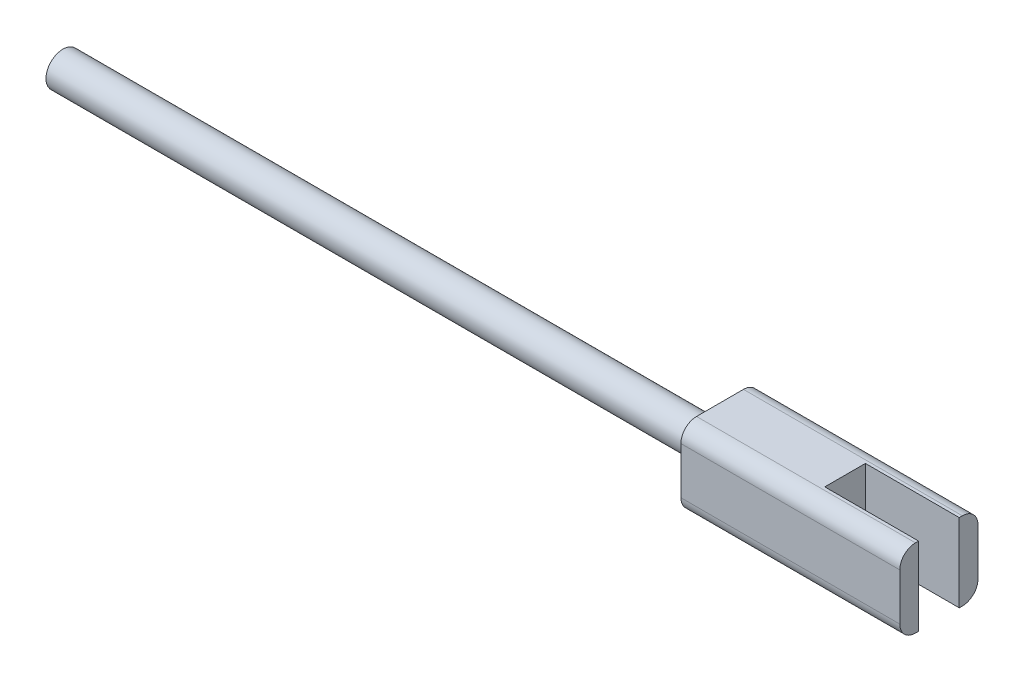
ISO-10303-21;
HEADER;
FILE_DESCRIPTION(('STEP AP214'),'2;1');
FILE_NAME('part.step','',(''),(''),'','','');
FILE_SCHEMA(('AUTOMOTIVE_DESIGN { 1 0 10303 214 1 1 1 1 }'));
ENDSEC;
DATA;
#1=APPLICATION_CONTEXT('core data for automotive mechanical design processes');
#2=APPLICATION_PROTOCOL_DEFINITION('international standard','automotive_design',2000,#1);
#3=PRODUCT_CONTEXT('',#1,'mechanical');
#4=PRODUCT('Part','Part','',(#3));
#5=PRODUCT_RELATED_PRODUCT_CATEGORY('part','',(#4));
#6=PRODUCT_DEFINITION_FORMATION('','',#4);
#7=PRODUCT_DEFINITION_CONTEXT('part definition',#1,'design');
#8=PRODUCT_DEFINITION('design','',#6,#7);
#9=PRODUCT_DEFINITION_SHAPE('','',#8);
#10=(LENGTH_UNIT() NAMED_UNIT(*) SI_UNIT(.MILLI.,.METRE.));
#11=(NAMED_UNIT(*) PLANE_ANGLE_UNIT() SI_UNIT($,.RADIAN.));
#12=(NAMED_UNIT(*) SI_UNIT($,.STERADIAN.) SOLID_ANGLE_UNIT());
#13=UNCERTAINTY_MEASURE_WITH_UNIT(LENGTH_MEASURE(1.E-05),#10,'distance_accuracy_value','');
#14=(GEOMETRIC_REPRESENTATION_CONTEXT(3) GLOBAL_UNCERTAINTY_ASSIGNED_CONTEXT((#13)) GLOBAL_UNIT_ASSIGNED_CONTEXT((#10,
#11,#12)) REPRESENTATION_CONTEXT('',''));
#15=CARTESIAN_POINT('',(0.,0.,0.));
#16=DIRECTION('',(0.,0.,1.));
#17=DIRECTION('',(1.,0.,0.));
#18=AXIS2_PLACEMENT_3D('',#15,#16,#17);
#19=CARTESIAN_POINT('',(56.016,-1.5,1.5));
#20=DIRECTION('',(1.,0.,0.));
#21=DIRECTION('',(0.,0.,-1.));
#22=AXIS2_PLACEMENT_3D('',#19,#20,#21);
#23=PLANE('',#22);
#24=DIRECTION('',(0.,1.,0.));
#25=VECTOR('',#24,1.);
#26=CARTESIAN_POINT('',(56.016,-1.5,-1.3));
#27=LINE('',#26,#25);
#28=CARTESIAN_POINT('',(56.016,-2.5,-1.3));
#29=VERTEX_POINT('',#28);
#30=CARTESIAN_POINT('',(56.016,2.5,-1.3));
#31=VERTEX_POINT('',#30);
#32=EDGE_CURVE('E11',#29,#31,#27,.T.);
#33=ORIENTED_EDGE('',*,*,#32,.F.);
#34=DIRECTION('',(0.,0.,-1.));
#35=VECTOR('',#34,1.);
#36=CARTESIAN_POINT('',(56.016,-2.5,1.5));
#37=LINE('',#36,#35);
#38=CARTESIAN_POINT('',(56.016,-2.5,-1.5));
#39=VERTEX_POINT('',#38);
#40=EDGE_CURVE('E202',#29,#39,#37,.T.);
#41=ORIENTED_EDGE('',*,*,#40,.T.);
#42=CARTESIAN_POINT('',(56.016,-1.5,-1.5));
#43=DIRECTION('',(1.,0.,0.));
#44=DIRECTION('',(0.,0.,-1.));
#45=AXIS2_PLACEMENT_3D('',#42,#43,#44);
#46=CIRCLE('',#45,1.);
#47=CARTESIAN_POINT('',(56.016,-1.5,-2.5));
#48=VERTEX_POINT('',#47);
#49=EDGE_CURVE('E201',#39,#48,#46,.T.);
#50=ORIENTED_EDGE('',*,*,#49,.T.);
#51=DIRECTION('',(0.,1.,0.));
#52=VECTOR('',#51,1.);
#53=CARTESIAN_POINT('',(56.016,-1.5,-2.5));
#54=LINE('',#53,#52);
#55=CARTESIAN_POINT('',(56.016,1.5,-2.5));
#56=VERTEX_POINT('',#55);
#57=EDGE_CURVE('E204',#48,#56,#54,.T.);
#58=ORIENTED_EDGE('',*,*,#57,.T.);
#59=CARTESIAN_POINT('',(56.016,1.5,-1.5));
#60=DIRECTION('',(1.,0.,0.));
#61=DIRECTION('',(0.,0.,-1.));
#62=AXIS2_PLACEMENT_3D('',#59,#60,#61);
#63=CIRCLE('',#62,1.);
#64=CARTESIAN_POINT('',(56.016,2.5,-1.5));
#65=VERTEX_POINT('',#64);
#66=EDGE_CURVE('E129',#56,#65,#63,.T.);
#67=ORIENTED_EDGE('',*,*,#66,.T.);
#68=DIRECTION('',(0.,0.,1.));
#69=VECTOR('',#68,1.);
#70=CARTESIAN_POINT('',(56.016,2.5,-1.5));
#71=LINE('',#70,#69);
#72=EDGE_CURVE('E128',#65,#31,#71,.T.);
#73=ORIENTED_EDGE('',*,*,#72,.T.);
#74=EDGE_LOOP('',(#33,#41,#50,#58,#67,#73));
#75=FACE_BOUND('',#74,.T.);
#76=ADVANCED_FACE('F39',(#75),#23,.T.);
#77=CARTESIAN_POINT('',(44.016,0.,0.));
#78=DIRECTION('',(-1.,0.,0.));
#79=DIRECTION('',(0.,0.,1.));
#80=AXIS2_PLACEMENT_3D('',#77,#78,#79);
#81=CYLINDRICAL_SURFACE('',#80,1.09);
#82=CARTESIAN_POINT('',(0.,0.,0.));
#83=DIRECTION('',(1.,0.,0.));
#84=DIRECTION('',(0.,0.,-1.));
#85=AXIS2_PLACEMENT_3D('',#82,#83,#84);
#86=CIRCLE('',#85,1.09);
#87=CARTESIAN_POINT('',(0.,0.,-1.09));
#88=VERTEX_POINT('',#87);
#89=EDGE_CURVE('E181',#88,#88,#86,.T.);
#90=ORIENTED_EDGE('',*,*,#89,.T.);
#91=EDGE_LOOP('',(#90));
#92=FACE_BOUND('',#91,.T.);
#93=CARTESIAN_POINT('',(42.016,0.,0.));
#94=DIRECTION('',(1.,0.,0.));
#95=DIRECTION('',(0.,0.,-1.));
#96=AXIS2_PLACEMENT_3D('',#93,#94,#95);
#97=CIRCLE('',#96,1.09);
#98=CARTESIAN_POINT('',(42.016,0.,-1.09));
#99=VERTEX_POINT('',#98);
#100=EDGE_CURVE('E184',#99,#99,#97,.T.);
#101=ORIENTED_EDGE('',*,*,#100,.F.);
#102=EDGE_LOOP('',(#101));
#103=FACE_BOUND('',#102,.T.);
#104=ADVANCED_FACE('F41',(#92,#103),#81,.T.);
#105=CARTESIAN_POINT('',(0.,0.,0.));
#106=DIRECTION('',(1.,0.,0.));
#107=DIRECTION('',(0.,0.,-1.));
#108=AXIS2_PLACEMENT_3D('',#105,#106,#107);
#109=PLANE('',#108);
#110=ORIENTED_EDGE('',*,*,#89,.F.);
#111=EDGE_LOOP('',(#110));
#112=FACE_BOUND('',#111,.T.);
#113=ADVANCED_FACE('F264',(#112),#109,.F.);
#114=CARTESIAN_POINT('',(56.016,-1.5,1.5));
#115=DIRECTION('',(-1.,0.,0.));
#116=DIRECTION('',(0.,0.,1.));
#117=AXIS2_PLACEMENT_3D('',#114,#115,#116);
#118=CYLINDRICAL_SURFACE('',#117,1.);
#119=CARTESIAN_POINT('',(42.016,-1.5,1.5));
#120=DIRECTION('',(1.,0.,0.));
#121=DIRECTION('',(0.,0.,-1.));
#122=AXIS2_PLACEMENT_3D('',#119,#120,#121);
#123=CIRCLE('',#122,1.);
#124=CARTESIAN_POINT('',(42.016,-1.5,2.5));
#125=VERTEX_POINT('',#124);
#126=CARTESIAN_POINT('',(42.016,-2.5,1.5));
#127=VERTEX_POINT('',#126);
#128=EDGE_CURVE('E150',#125,#127,#123,.T.);
#129=ORIENTED_EDGE('',*,*,#128,.T.);
#130=DIRECTION('',(-1.,0.,0.));
#131=VECTOR('',#130,1.);
#132=CARTESIAN_POINT('',(56.016,-2.5,1.5));
#133=LINE('',#132,#131);
#134=CARTESIAN_POINT('',(56.016,-2.5,1.5));
#135=VERTEX_POINT('',#134);
#136=EDGE_CURVE('E179',#135,#127,#133,.T.);
#137=ORIENTED_EDGE('',*,*,#136,.F.);
#138=CARTESIAN_POINT('',(56.016,-1.5,1.5));
#139=DIRECTION('',(1.,0.,0.));
#140=DIRECTION('',(0.,0.,-1.));
#141=AXIS2_PLACEMENT_3D('',#138,#139,#140);
#142=CIRCLE('',#141,1.);
#143=CARTESIAN_POINT('',(56.016,-1.5,2.5));
#144=VERTEX_POINT('',#143);
#145=EDGE_CURVE('E166',#144,#135,#142,.T.);
#146=ORIENTED_EDGE('',*,*,#145,.F.);
#147=DIRECTION('',(-1.,0.,0.));
#148=VECTOR('',#147,1.);
#149=CARTESIAN_POINT('',(56.016,-1.5,2.5));
#150=LINE('',#149,#148);
#151=EDGE_CURVE('E145',#144,#125,#150,.T.);
#152=ORIENTED_EDGE('',*,*,#151,.T.);
#153=EDGE_LOOP('',(#129,#137,#146,#152));
#154=FACE_BOUND('',#153,.T.);
#155=ADVANCED_FACE('F262',(#154),#118,.T.);
#156=CARTESIAN_POINT('',(56.016,-2.5,1.5));
#157=DIRECTION('',(0.,1.,0.));
#158=DIRECTION('',(0.,0.,1.));
#159=AXIS2_PLACEMENT_3D('',#156,#157,#158);
#160=PLANE('',#159);
#161=ORIENTED_EDGE('',*,*,#40,.F.);
#162=DIRECTION('',(-1.,0.,0.));
#163=VECTOR('',#162,1.);
#164=CARTESIAN_POINT('',(50.016,-2.5,-1.3));
#165=LINE('',#164,#163);
#166=CARTESIAN_POINT('',(50.016,-2.5,-1.3));
#167=VERTEX_POINT('',#166);
#168=EDGE_CURVE('E197',#29,#167,#165,.T.);
#169=ORIENTED_EDGE('',*,*,#168,.T.);
#170=DIRECTION('',(0.,0.,1.));
#171=VECTOR('',#170,1.);
#172=CARTESIAN_POINT('',(50.016,-2.5,1.3));
#173=LINE('',#172,#171);
#174=CARTESIAN_POINT('',(50.016,-2.5,1.3));
#175=VERTEX_POINT('',#174);
#176=EDGE_CURVE('E196',#167,#175,#173,.T.);
#177=ORIENTED_EDGE('',*,*,#176,.T.);
#178=DIRECTION('',(1.,0.,0.));
#179=VECTOR('',#178,1.);
#180=CARTESIAN_POINT('',(57.016,-2.5,1.3));
#181=LINE('',#180,#179);
#182=CARTESIAN_POINT('',(56.016,-2.5,1.3));
#183=VERTEX_POINT('',#182);
#184=EDGE_CURVE('E189',#175,#183,#181,.T.);
#185=ORIENTED_EDGE('',*,*,#184,.T.);
#186=EDGE_CURVE('E105',#135,#183,#37,.T.);
#187=ORIENTED_EDGE('',*,*,#186,.F.);
#188=ORIENTED_EDGE('',*,*,#136,.T.);
#189=DIRECTION('',(0.,0.,-1.));
#190=VECTOR('',#189,1.);
#191=CARTESIAN_POINT('',(42.016,-2.5,1.5));
#192=LINE('',#191,#190);
#193=CARTESIAN_POINT('',(42.016,-2.5,-1.5));
#194=VERTEX_POINT('',#193);
#195=EDGE_CURVE('E153',#127,#194,#192,.T.);
#196=ORIENTED_EDGE('',*,*,#195,.T.);
#197=DIRECTION('',(-1.,0.,0.));
#198=VECTOR('',#197,1.);
#199=CARTESIAN_POINT('',(56.016,-2.5,-1.5));
#200=LINE('',#199,#198);
#201=EDGE_CURVE('E176',#39,#194,#200,.T.);
#202=ORIENTED_EDGE('',*,*,#201,.F.);
#203=EDGE_LOOP('',(#161,#169,#177,#185,#187,#188,#196,#202));
#204=FACE_BOUND('',#203,.T.);
#205=ADVANCED_FACE('F193',(#204),#160,.F.);
#206=CARTESIAN_POINT('',(56.016,-1.5,-1.5));
#207=DIRECTION('',(-1.,0.,0.));
#208=DIRECTION('',(0.,0.,1.));
#209=AXIS2_PLACEMENT_3D('',#206,#207,#208);
#210=CYLINDRICAL_SURFACE('',#209,1.);
#211=CARTESIAN_POINT('',(42.016,-1.5,-1.5));
#212=DIRECTION('',(1.,0.,0.));
#213=DIRECTION('',(0.,0.,-1.));
#214=AXIS2_PLACEMENT_3D('',#211,#212,#213);
#215=CIRCLE('',#214,1.);
#216=CARTESIAN_POINT('',(42.016,-1.5,-2.5));
#217=VERTEX_POINT('',#216);
#218=EDGE_CURVE('E156',#194,#217,#215,.T.);
#219=ORIENTED_EDGE('',*,*,#218,.T.);
#220=DIRECTION('',(-1.,0.,0.));
#221=VECTOR('',#220,1.);
#222=CARTESIAN_POINT('',(56.016,-1.5,-2.5));
#223=LINE('',#222,#221);
#224=EDGE_CURVE('E173',#48,#217,#223,.T.);
#225=ORIENTED_EDGE('',*,*,#224,.F.);
#226=ORIENTED_EDGE('',*,*,#49,.F.);
#227=ORIENTED_EDGE('',*,*,#201,.T.);
#228=EDGE_LOOP('',(#219,#225,#226,#227));
#229=FACE_BOUND('',#228,.T.);
#230=ADVANCED_FACE('F253',(#229),#210,.T.);
#231=CARTESIAN_POINT('',(56.016,-1.5,-2.5));
#232=DIRECTION('',(0.,0.,1.));
#233=DIRECTION('',(1.,0.,0.));
#234=AXIS2_PLACEMENT_3D('',#231,#232,#233);
#235=PLANE('',#234);
#236=DIRECTION('',(0.,1.,0.));
#237=VECTOR('',#236,1.);
#238=CARTESIAN_POINT('',(42.016,-1.5,-2.5));
#239=LINE('',#238,#237);
#240=CARTESIAN_POINT('',(42.016,1.5,-2.5));
#241=VERTEX_POINT('',#240);
#242=EDGE_CURVE('E158',#217,#241,#239,.T.);
#243=ORIENTED_EDGE('',*,*,#242,.T.);
#244=DIRECTION('',(-1.,0.,0.));
#245=VECTOR('',#244,1.);
#246=CARTESIAN_POINT('',(56.016,1.5,-2.5));
#247=LINE('',#246,#245);
#248=EDGE_CURVE('E170',#56,#241,#247,.T.);
#249=ORIENTED_EDGE('',*,*,#248,.F.);
#250=ORIENTED_EDGE('',*,*,#57,.F.);
#251=ORIENTED_EDGE('',*,*,#224,.T.);
#252=EDGE_LOOP('',(#243,#249,#250,#251));
#253=FACE_BOUND('',#252,.T.);
#254=ADVANCED_FACE('F256',(#253),#235,.F.);
#255=CARTESIAN_POINT('',(56.016,1.5,-1.5));
#256=DIRECTION('',(-1.,0.,0.));
#257=DIRECTION('',(0.,0.,1.));
#258=AXIS2_PLACEMENT_3D('',#255,#256,#257);
#259=CYLINDRICAL_SURFACE('',#258,1.);
#260=CARTESIAN_POINT('',(42.016,1.5,-1.5));
#261=DIRECTION('',(1.,0.,0.));
#262=DIRECTION('',(0.,0.,-1.));
#263=AXIS2_PLACEMENT_3D('',#260,#261,#262);
#264=CIRCLE('',#263,1.);
#265=CARTESIAN_POINT('',(42.016,2.5,-1.5));
#266=VERTEX_POINT('',#265);
#267=EDGE_CURVE('E160',#241,#266,#264,.T.);
#268=ORIENTED_EDGE('',*,*,#267,.T.);
#269=DIRECTION('',(-1.,0.,0.));
#270=VECTOR('',#269,1.);
#271=CARTESIAN_POINT('',(56.016,2.5,-1.5));
#272=LINE('',#271,#270);
#273=EDGE_CURVE('E140',#65,#266,#272,.T.);
#274=ORIENTED_EDGE('',*,*,#273,.F.);
#275=ORIENTED_EDGE('',*,*,#66,.F.);
#276=ORIENTED_EDGE('',*,*,#248,.T.);
#277=EDGE_LOOP('',(#268,#274,#275,#276));
#278=FACE_BOUND('',#277,.T.);
#279=ADVANCED_FACE('F218',(#278),#259,.T.);
#280=CARTESIAN_POINT('',(56.016,2.5,-1.5));
#281=DIRECTION('',(0.,-1.,0.));
#282=DIRECTION('',(0.,0.,-1.));
#283=AXIS2_PLACEMENT_3D('',#280,#281,#282);
#284=PLANE('',#283);
#285=DIRECTION('',(0.,0.,1.));
#286=VECTOR('',#285,1.);
#287=CARTESIAN_POINT('',(50.016,2.5,1.3));
#288=LINE('',#287,#286);
#289=CARTESIAN_POINT('',(50.016,2.5,-1.3));
#290=VERTEX_POINT('',#289);
#291=CARTESIAN_POINT('',(50.016,2.5,1.3));
#292=VERTEX_POINT('',#291);
#293=EDGE_CURVE('E225',#290,#292,#288,.T.);
#294=ORIENTED_EDGE('',*,*,#293,.F.);
#295=DIRECTION('',(-1.,0.,0.));
#296=VECTOR('',#295,1.);
#297=CARTESIAN_POINT('',(50.016,2.5,-1.3));
#298=LINE('',#297,#296);
#299=EDGE_CURVE('E222',#31,#290,#298,.T.);
#300=ORIENTED_EDGE('',*,*,#299,.F.);
#301=ORIENTED_EDGE('',*,*,#72,.F.);
#302=ORIENTED_EDGE('',*,*,#273,.T.);
#303=DIRECTION('',(0.,0.,1.));
#304=VECTOR('',#303,1.);
#305=CARTESIAN_POINT('',(42.016,2.5,-1.5));
#306=LINE('',#305,#304);
#307=CARTESIAN_POINT('',(42.016,2.5,1.5));
#308=VERTEX_POINT('',#307);
#309=EDGE_CURVE('E137',#266,#308,#306,.T.);
#310=ORIENTED_EDGE('',*,*,#309,.T.);
#311=DIRECTION('',(-1.,0.,0.));
#312=VECTOR('',#311,1.);
#313=CARTESIAN_POINT('',(56.016,2.5,1.5));
#314=LINE('',#313,#312);
#315=CARTESIAN_POINT('',(56.016,2.5,1.5));
#316=VERTEX_POINT('',#315);
#317=EDGE_CURVE('E132',#316,#308,#314,.T.);
#318=ORIENTED_EDGE('',*,*,#317,.F.);
#319=CARTESIAN_POINT('',(56.016,2.5,1.3));
#320=VERTEX_POINT('',#319);
#321=EDGE_CURVE('E121',#320,#316,#71,.T.);
#322=ORIENTED_EDGE('',*,*,#321,.F.);
#323=DIRECTION('',(1.,0.,0.));
#324=VECTOR('',#323,1.);
#325=CARTESIAN_POINT('',(57.016,2.5,1.3));
#326=LINE('',#325,#324);
#327=EDGE_CURVE('E54',#292,#320,#326,.T.);
#328=ORIENTED_EDGE('',*,*,#327,.F.);
#329=EDGE_LOOP('',(#294,#300,#301,#302,#310,#318,#322,#328));
#330=FACE_BOUND('',#329,.T.);
#331=ADVANCED_FACE('F134',(#330),#284,.F.);
#332=CARTESIAN_POINT('',(56.016,1.5,1.5));
#333=DIRECTION('',(-1.,0.,0.));
#334=DIRECTION('',(0.,0.,1.));
#335=AXIS2_PLACEMENT_3D('',#332,#333,#334);
#336=CYLINDRICAL_SURFACE('',#335,1.);
#337=CARTESIAN_POINT('',(42.016,1.5,1.5));
#338=DIRECTION('',(1.,0.,0.));
#339=DIRECTION('',(0.,0.,-1.));
#340=AXIS2_PLACEMENT_3D('',#337,#338,#339);
#341=CIRCLE('',#340,1.);
#342=CARTESIAN_POINT('',(42.016,1.5,2.5));
#343=VERTEX_POINT('',#342);
#344=EDGE_CURVE('E163',#308,#343,#341,.T.);
#345=ORIENTED_EDGE('',*,*,#344,.T.);
#346=DIRECTION('',(-1.,0.,0.));
#347=VECTOR('',#346,1.);
#348=CARTESIAN_POINT('',(56.016,1.5,2.5));
#349=LINE('',#348,#347);
#350=CARTESIAN_POINT('',(56.016,1.5,2.5));
#351=VERTEX_POINT('',#350);
#352=EDGE_CURVE('E141',#351,#343,#349,.T.);
#353=ORIENTED_EDGE('',*,*,#352,.F.);
#354=CARTESIAN_POINT('',(56.016,1.5,1.5));
#355=DIRECTION('',(1.,0.,0.));
#356=DIRECTION('',(0.,0.,-1.));
#357=AXIS2_PLACEMENT_3D('',#354,#355,#356);
#358=CIRCLE('',#357,1.);
#359=EDGE_CURVE('E125',#316,#351,#358,.T.);
#360=ORIENTED_EDGE('',*,*,#359,.F.);
#361=ORIENTED_EDGE('',*,*,#317,.T.);
#362=EDGE_LOOP('',(#345,#353,#360,#361));
#363=FACE_BOUND('',#362,.T.);
#364=ADVANCED_FACE('F143',(#363),#336,.T.);
#365=CARTESIAN_POINT('',(56.016,1.5,2.5));
#366=DIRECTION('',(0.,0.,-1.));
#367=DIRECTION('',(-1.,0.,0.));
#368=AXIS2_PLACEMENT_3D('',#365,#366,#367);
#369=PLANE('',#368);
#370=DIRECTION('',(0.,-1.,0.));
#371=VECTOR('',#370,1.);
#372=CARTESIAN_POINT('',(42.016,1.5,2.5));
#373=LINE('',#372,#371);
#374=EDGE_CURVE('E96',#343,#125,#373,.T.);
#375=ORIENTED_EDGE('',*,*,#374,.T.);
#376=ORIENTED_EDGE('',*,*,#151,.F.);
#377=DIRECTION('',(0.,-1.,0.));
#378=VECTOR('',#377,1.);
#379=CARTESIAN_POINT('',(56.016,1.5,2.5));
#380=LINE('',#379,#378);
#381=EDGE_CURVE('E63',#351,#144,#380,.T.);
#382=ORIENTED_EDGE('',*,*,#381,.F.);
#383=ORIENTED_EDGE('',*,*,#352,.T.);
#384=EDGE_LOOP('',(#375,#376,#382,#383));
#385=FACE_BOUND('',#384,.T.);
#386=ADVANCED_FACE('F260',(#385),#369,.F.);
#387=DIRECTION('',(0.,-1.,0.));
#388=VECTOR('',#387,1.);
#389=CARTESIAN_POINT('',(56.016,-1.5,1.3));
#390=LINE('',#389,#388);
#391=EDGE_CURVE('E47',#320,#183,#390,.T.);
#392=ORIENTED_EDGE('',*,*,#391,.F.);
#393=ORIENTED_EDGE('',*,*,#321,.T.);
#394=ORIENTED_EDGE('',*,*,#359,.T.);
#395=ORIENTED_EDGE('',*,*,#381,.T.);
#396=ORIENTED_EDGE('',*,*,#145,.T.);
#397=ORIENTED_EDGE('',*,*,#186,.T.);
#398=EDGE_LOOP('',(#392,#393,#394,#395,#396,#397));
#399=FACE_BOUND('',#398,.T.);
#400=ADVANCED_FACE('F123',(#399),#23,.T.);
#401=CARTESIAN_POINT('',(42.016,-1.5,1.5));
#402=DIRECTION('',(1.,0.,0.));
#403=DIRECTION('',(0.,0.,-1.));
#404=AXIS2_PLACEMENT_3D('',#401,#402,#403);
#405=PLANE('',#404);
#406=ORIENTED_EDGE('',*,*,#100,.T.);
#407=EDGE_LOOP('',(#406));
#408=FACE_BOUND('',#407,.T.);
#409=ORIENTED_EDGE('',*,*,#128,.F.);
#410=ORIENTED_EDGE('',*,*,#374,.F.);
#411=ORIENTED_EDGE('',*,*,#344,.F.);
#412=ORIENTED_EDGE('',*,*,#309,.F.);
#413=ORIENTED_EDGE('',*,*,#267,.F.);
#414=ORIENTED_EDGE('',*,*,#242,.F.);
#415=ORIENTED_EDGE('',*,*,#218,.F.);
#416=ORIENTED_EDGE('',*,*,#195,.F.);
#417=EDGE_LOOP('',(#409,#410,#411,#412,#413,#414,#415,#416));
#418=FACE_BOUND('',#417,.T.);
#419=ADVANCED_FACE('F259',(#408,#418),#405,.F.);
#420=CARTESIAN_POINT('',(50.016,-2.5,1.3));
#421=DIRECTION('',(-1.,0.,0.));
#422=DIRECTION('',(0.,0.,1.));
#423=AXIS2_PLACEMENT_3D('',#420,#421,#422);
#424=PLANE('',#423);
#425=DIRECTION('',(0.,1.,0.));
#426=VECTOR('',#425,1.);
#427=CARTESIAN_POINT('',(50.016,-2.5,1.3));
#428=LINE('',#427,#426);
#429=EDGE_CURVE('E237',#175,#292,#428,.T.);
#430=ORIENTED_EDGE('',*,*,#429,.F.);
#431=ORIENTED_EDGE('',*,*,#176,.F.);
#432=DIRECTION('',(0.,1.,0.));
#433=VECTOR('',#432,1.);
#434=CARTESIAN_POINT('',(50.016,-2.5,-1.3));
#435=LINE('',#434,#433);
#436=EDGE_CURVE('E154',#167,#290,#435,.T.);
#437=ORIENTED_EDGE('',*,*,#436,.T.);
#438=ORIENTED_EDGE('',*,*,#293,.T.);
#439=EDGE_LOOP('',(#430,#431,#437,#438));
#440=FACE_BOUND('',#439,.T.);
#441=ADVANCED_FACE('F242',(#440),#424,.F.);
#442=CARTESIAN_POINT('',(50.016,-2.5,-1.3));
#443=DIRECTION('',(0.,0.,-1.));
#444=DIRECTION('',(-1.,0.,0.));
#445=AXIS2_PLACEMENT_3D('',#442,#443,#444);
#446=PLANE('',#445);
#447=ORIENTED_EDGE('',*,*,#32,.T.);
#448=ORIENTED_EDGE('',*,*,#299,.T.);
#449=ORIENTED_EDGE('',*,*,#436,.F.);
#450=ORIENTED_EDGE('',*,*,#168,.F.);
#451=EDGE_LOOP('',(#447,#448,#449,#450));
#452=FACE_BOUND('',#451,.T.);
#453=ADVANCED_FACE('F245',(#452),#446,.F.);
#454=CARTESIAN_POINT('',(57.016,-2.5,1.3));
#455=DIRECTION('',(0.,0.,1.));
#456=DIRECTION('',(1.,0.,0.));
#457=AXIS2_PLACEMENT_3D('',#454,#455,#456);
#458=PLANE('',#457);
#459=ORIENTED_EDGE('',*,*,#391,.T.);
#460=ORIENTED_EDGE('',*,*,#184,.F.);
#461=ORIENTED_EDGE('',*,*,#429,.T.);
#462=ORIENTED_EDGE('',*,*,#327,.T.);
#463=EDGE_LOOP('',(#459,#460,#461,#462));
#464=FACE_BOUND('',#463,.T.);
#465=ADVANCED_FACE('F187',(#464),#458,.F.);
#466=CLOSED_SHELL('',(#76,#104,#113,#155,#205,#230,#254,#279,#331,#364,#386,#400,#419,#441,#453,#465));
#467=MANIFOLD_SOLID_BREP('B2',#466);
#468=ADVANCED_BREP_SHAPE_REPRESENTATION('',(#18,#467),#14);
#469=SHAPE_DEFINITION_REPRESENTATION(#9,#468);
ENDSEC;
END-ISO-10303-21;
